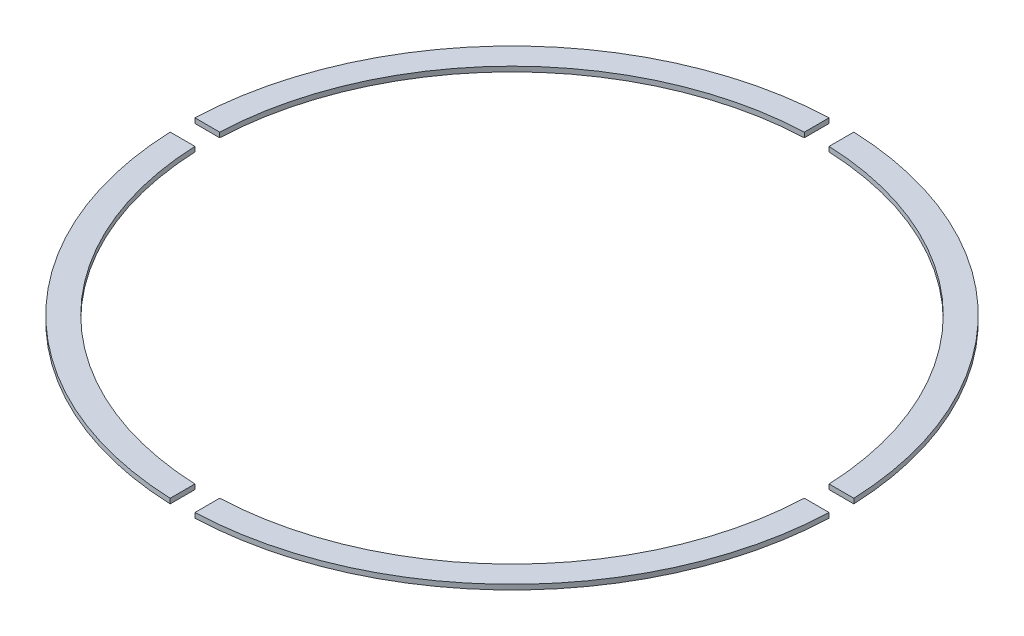
ISO-10303-21;
HEADER;
FILE_DESCRIPTION(('STEP AP214'),'2;1');
FILE_NAME('part.step','',(''),(''),'','','');
FILE_SCHEMA(('AUTOMOTIVE_DESIGN { 1 0 10303 214 1 1 1 1 }'));
ENDSEC;
DATA;
#1=APPLICATION_CONTEXT('core data for automotive mechanical design processes');
#2=APPLICATION_PROTOCOL_DEFINITION('international standard','automotive_design',2000,#1);
#3=PRODUCT_CONTEXT('',#1,'mechanical');
#4=PRODUCT('Part','Part','',(#3));
#5=PRODUCT_RELATED_PRODUCT_CATEGORY('part','',(#4));
#6=PRODUCT_DEFINITION_FORMATION('','',#4);
#7=PRODUCT_DEFINITION_CONTEXT('part definition',#1,'design');
#8=PRODUCT_DEFINITION('design','',#6,#7);
#9=PRODUCT_DEFINITION_SHAPE('','',#8);
#10=(LENGTH_UNIT() NAMED_UNIT(*) SI_UNIT(.MILLI.,.METRE.));
#11=(NAMED_UNIT(*) PLANE_ANGLE_UNIT() SI_UNIT($,.RADIAN.));
#12=(NAMED_UNIT(*) SI_UNIT($,.STERADIAN.) SOLID_ANGLE_UNIT());
#13=UNCERTAINTY_MEASURE_WITH_UNIT(LENGTH_MEASURE(1.E-05),#10,'distance_accuracy_value','');
#14=(GEOMETRIC_REPRESENTATION_CONTEXT(3) GLOBAL_UNCERTAINTY_ASSIGNED_CONTEXT((#13)) GLOBAL_UNIT_ASSIGNED_CONTEXT((#10,
#11,#12)) REPRESENTATION_CONTEXT('',''));
#15=CARTESIAN_POINT('',(0.,0.,0.));
#16=DIRECTION('',(0.,0.,1.));
#17=DIRECTION('',(1.,0.,0.));
#18=AXIS2_PLACEMENT_3D('',#15,#16,#17);
#19=CARTESIAN_POINT('',(0.,1.5,0.));
#20=DIRECTION('',(0.,1.,0.));
#21=DIRECTION('',(0.,0.,1.));
#22=AXIS2_PLACEMENT_3D('',#19,#20,#21);
#23=PLANE('',#22);
#24=DIRECTION('',(0.,0.,-1.));
#25=VECTOR('',#24,1.);
#26=CARTESIAN_POINT('',(7.49999999999945,1.5,157.644661834944));
#27=LINE('',#26,#25);
#28=CARTESIAN_POINT('',(7.4999999999993,1.5,199.859325526731));
#29=VERTEX_POINT('',#28);
#30=CARTESIAN_POINT('',(7.49999999999936,1.5,184.847910456137));
#31=VERTEX_POINT('',#30);
#32=EDGE_CURVE('E53',#29,#31,#27,.T.);
#33=ORIENTED_EDGE('',*,*,#32,.F.);
#34=CARTESIAN_POINT('',(0.,1.5,0.));
#35=DIRECTION('',(0.,1.,0.));
#36=DIRECTION('',(0.,0.,1.));
#37=AXIS2_PLACEMENT_3D('',#34,#35,#36);
#38=CIRCLE('',#37,200.);
#39=CARTESIAN_POINT('',(199.859325526731,1.5,7.5));
#40=VERTEX_POINT('',#39);
#41=EDGE_CURVE('E105',#29,#40,#38,.T.);
#42=ORIENTED_EDGE('',*,*,#41,.T.);
#43=DIRECTION('',(1.,0.,0.));
#44=VECTOR('',#43,1.);
#45=CARTESIAN_POINT('',(157.644661834944,1.5,7.5));
#46=LINE('',#45,#44);
#47=CARTESIAN_POINT('',(184.847910456137,1.5,7.5));
#48=VERTEX_POINT('',#47);
#49=EDGE_CURVE('E86',#48,#40,#46,.T.);
#50=ORIENTED_EDGE('',*,*,#49,.F.);
#51=CARTESIAN_POINT('',(0.,1.5,0.));
#52=DIRECTION('',(0.,1.,0.));
#53=DIRECTION('',(0.,0.,1.));
#54=AXIS2_PLACEMENT_3D('',#51,#52,#53);
#55=CIRCLE('',#54,185.);
#56=EDGE_CURVE('E92',#31,#48,#55,.T.);
#57=ORIENTED_EDGE('',*,*,#56,.F.);
#58=EDGE_LOOP('',(#33,#42,#50,#57));
#59=FACE_BOUND('',#58,.T.);
#60=ADVANCED_FACE('F45',(#59),#23,.T.);
#61=CARTESIAN_POINT('',(0.,-1.5,0.));
#62=DIRECTION('',(0.,1.,0.));
#63=DIRECTION('',(0.,0.,1.));
#64=AXIS2_PLACEMENT_3D('',#61,#62,#63);
#65=PLANE('',#64);
#66=CARTESIAN_POINT('',(0.,-1.5,0.));
#67=DIRECTION('',(0.,1.,0.));
#68=DIRECTION('',(0.,0.,1.));
#69=AXIS2_PLACEMENT_3D('',#66,#67,#68);
#70=CIRCLE('',#69,200.);
#71=CARTESIAN_POINT('',(7.4999999999993,-1.5,199.859325526731));
#72=VERTEX_POINT('',#71);
#73=CARTESIAN_POINT('',(199.859325526731,-1.5,7.5));
#74=VERTEX_POINT('',#73);
#75=EDGE_CURVE('E48',#72,#74,#70,.T.);
#76=ORIENTED_EDGE('',*,*,#75,.F.);
#77=DIRECTION('',(0.,0.,-1.));
#78=VECTOR('',#77,1.);
#79=CARTESIAN_POINT('',(7.49999999999945,-1.5,157.644661834944));
#80=LINE('',#79,#78);
#81=CARTESIAN_POINT('',(7.49999999999936,-1.5,184.847910456137));
#82=VERTEX_POINT('',#81);
#83=EDGE_CURVE('E65',#72,#82,#80,.T.);
#84=ORIENTED_EDGE('',*,*,#83,.T.);
#85=CARTESIAN_POINT('',(0.,-1.5,0.));
#86=DIRECTION('',(0.,1.,0.));
#87=DIRECTION('',(0.,0.,1.));
#88=AXIS2_PLACEMENT_3D('',#85,#86,#87);
#89=CIRCLE('',#88,185.);
#90=CARTESIAN_POINT('',(184.847910456137,-1.5,7.5));
#91=VERTEX_POINT('',#90);
#92=EDGE_CURVE('E94',#82,#91,#89,.T.);
#93=ORIENTED_EDGE('',*,*,#92,.T.);
#94=DIRECTION('',(1.,0.,0.));
#95=VECTOR('',#94,1.);
#96=CARTESIAN_POINT('',(157.644661834944,-1.5,7.5));
#97=LINE('',#96,#95);
#98=EDGE_CURVE('E104',#91,#74,#97,.T.);
#99=ORIENTED_EDGE('',*,*,#98,.T.);
#100=EDGE_LOOP('',(#76,#84,#93,#99));
#101=FACE_BOUND('',#100,.T.);
#102=ADVANCED_FACE('F114',(#101),#65,.F.);
#103=CARTESIAN_POINT('',(0.,1.5,0.));
#104=DIRECTION('',(0.,-1.,0.));
#105=DIRECTION('',(0.,0.,-1.));
#106=AXIS2_PLACEMENT_3D('',#103,#104,#105);
#107=CYLINDRICAL_SURFACE('',#106,200.);
#108=ORIENTED_EDGE('',*,*,#41,.F.);
#109=DIRECTION('',(0.,-1.,0.));
#110=VECTOR('',#109,1.);
#111=CARTESIAN_POINT('',(7.4999999999993,1.5,199.859325526731));
#112=LINE('',#111,#110);
#113=EDGE_CURVE('E61',#29,#72,#112,.T.);
#114=ORIENTED_EDGE('',*,*,#113,.T.);
#115=ORIENTED_EDGE('',*,*,#75,.T.);
#116=DIRECTION('',(0.,-1.,0.));
#117=VECTOR('',#116,1.);
#118=CARTESIAN_POINT('',(199.859325526731,1.5,7.5));
#119=LINE('',#118,#117);
#120=EDGE_CURVE('E98',#74,#40,#119,.F.);
#121=ORIENTED_EDGE('',*,*,#120,.T.);
#122=EDGE_LOOP('',(#108,#114,#115,#121));
#123=FACE_BOUND('',#122,.T.);
#124=ADVANCED_FACE('F119',(#123),#107,.T.);
#125=CARTESIAN_POINT('',(0.,1.5,0.));
#126=DIRECTION('',(0.,-1.,0.));
#127=DIRECTION('',(0.,0.,-1.));
#128=AXIS2_PLACEMENT_3D('',#125,#126,#127);
#129=CYLINDRICAL_SURFACE('',#128,185.);
#130=DIRECTION('',(0.,-1.,0.));
#131=VECTOR('',#130,1.);
#132=CARTESIAN_POINT('',(7.49999999999936,1.5,184.847910456137));
#133=LINE('',#132,#131);
#134=EDGE_CURVE('E12',#31,#82,#133,.T.);
#135=ORIENTED_EDGE('',*,*,#134,.F.);
#136=ORIENTED_EDGE('',*,*,#56,.T.);
#137=DIRECTION('',(0.,-1.,0.));
#138=VECTOR('',#137,1.);
#139=CARTESIAN_POINT('',(184.847910456137,1.5,7.5));
#140=LINE('',#139,#138);
#141=EDGE_CURVE('E97',#91,#48,#140,.F.);
#142=ORIENTED_EDGE('',*,*,#141,.F.);
#143=ORIENTED_EDGE('',*,*,#92,.F.);
#144=EDGE_LOOP('',(#135,#136,#142,#143));
#145=FACE_BOUND('',#144,.T.);
#146=ADVANCED_FACE('F90',(#145),#129,.F.);
#147=CARTESIAN_POINT('',(157.644661834944,-1.5,7.5));
#148=DIRECTION('',(0.,0.,1.));
#149=DIRECTION('',(1.,0.,0.));
#150=AXIS2_PLACEMENT_3D('',#147,#148,#149);
#151=PLANE('',#150);
#152=ORIENTED_EDGE('',*,*,#98,.F.);
#153=ORIENTED_EDGE('',*,*,#141,.T.);
#154=ORIENTED_EDGE('',*,*,#49,.T.);
#155=ORIENTED_EDGE('',*,*,#120,.F.);
#156=EDGE_LOOP('',(#152,#153,#154,#155));
#157=FACE_BOUND('',#156,.T.);
#158=ADVANCED_FACE('F117',(#157),#151,.F.);
#159=CARTESIAN_POINT('',(7.49999999999945,-1.5,157.644661834944));
#160=DIRECTION('',(1.,0.,0.));
#161=DIRECTION('',(0.,0.,-1.));
#162=AXIS2_PLACEMENT_3D('',#159,#160,#161);
#163=PLANE('',#162);
#164=ORIENTED_EDGE('',*,*,#32,.T.);
#165=ORIENTED_EDGE('',*,*,#134,.T.);
#166=ORIENTED_EDGE('',*,*,#83,.F.);
#167=ORIENTED_EDGE('',*,*,#113,.F.);
#168=EDGE_LOOP('',(#164,#165,#166,#167));
#169=FACE_BOUND('',#168,.T.);
#170=ADVANCED_FACE('F82',(#169),#163,.F.);
#171=CLOSED_SHELL('',(#60,#102,#124,#146,#158,#170));
#172=MANIFOLD_SOLID_BREP('B2',#171);
#173=CARTESIAN_POINT('',(0.,1.5,0.));
#174=DIRECTION('',(0.,-1.,0.));
#175=DIRECTION('',(0.,0.,-1.));
#176=AXIS2_PLACEMENT_3D('',#173,#174,#175);
#177=CYLINDRICAL_SURFACE('',#176,200.);
#178=CARTESIAN_POINT('',(0.,-1.5,0.));
#179=DIRECTION('',(0.,1.,0.));
#180=DIRECTION('',(0.,0.,1.));
#181=AXIS2_PLACEMENT_3D('',#178,#179,#180);
#182=CIRCLE('',#181,200.);
#183=CARTESIAN_POINT('',(-7.49999999999791,-1.5,-199.859325526732));
#184=VERTEX_POINT('',#183);
#185=CARTESIAN_POINT('',(-199.859325526731,-1.5,-7.5));
#186=VERTEX_POINT('',#185);
#187=EDGE_CURVE('E182',#184,#186,#182,.T.);
#188=ORIENTED_EDGE('',*,*,#187,.T.);
#189=DIRECTION('',(0.,-1.,0.));
#190=VECTOR('',#189,1.);
#191=CARTESIAN_POINT('',(-199.859325526731,1.5,-7.5));
#192=LINE('',#191,#190);
#193=CARTESIAN_POINT('',(-199.859325526731,1.5,-7.5));
#194=VERTEX_POINT('',#193);
#195=EDGE_CURVE('E196',#186,#194,#192,.F.);
#196=ORIENTED_EDGE('',*,*,#195,.T.);
#197=CARTESIAN_POINT('',(0.,1.5,0.));
#198=DIRECTION('',(0.,1.,0.));
#199=DIRECTION('',(0.,0.,1.));
#200=AXIS2_PLACEMENT_3D('',#197,#198,#199);
#201=CIRCLE('',#200,200.);
#202=CARTESIAN_POINT('',(-7.49999999999791,1.5,-199.859325526732));
#203=VERTEX_POINT('',#202);
#204=EDGE_CURVE('E241',#203,#194,#201,.T.);
#205=ORIENTED_EDGE('',*,*,#204,.F.);
#206=DIRECTION('',(0.,-1.,0.));
#207=VECTOR('',#206,1.);
#208=CARTESIAN_POINT('',(-7.49999999999791,1.5,-199.859325526732));
#209=LINE('',#208,#207);
#210=EDGE_CURVE('E217',#203,#184,#209,.T.);
#211=ORIENTED_EDGE('',*,*,#210,.T.);
#212=EDGE_LOOP('',(#188,#196,#205,#211));
#213=FACE_BOUND('',#212,.T.);
#214=ADVANCED_FACE('F178',(#213),#177,.T.);
#215=CARTESIAN_POINT('',(0.,1.5,0.));
#216=DIRECTION('',(0.,-1.,0.));
#217=DIRECTION('',(0.,0.,-1.));
#218=AXIS2_PLACEMENT_3D('',#215,#216,#217);
#219=CYLINDRICAL_SURFACE('',#218,185.);
#220=DIRECTION('',(0.,-1.,0.));
#221=VECTOR('',#220,1.);
#222=CARTESIAN_POINT('',(-184.847910456137,1.5,-7.5));
#223=LINE('',#222,#221);
#224=CARTESIAN_POINT('',(-184.847910456137,-1.5,-7.5));
#225=VERTEX_POINT('',#224);
#226=CARTESIAN_POINT('',(-184.847910456137,1.5,-7.5));
#227=VERTEX_POINT('',#226);
#228=EDGE_CURVE('E188',#225,#227,#223,.F.);
#229=ORIENTED_EDGE('',*,*,#228,.F.);
#230=CARTESIAN_POINT('',(0.,-1.5,0.));
#231=DIRECTION('',(0.,1.,0.));
#232=DIRECTION('',(0.,0.,1.));
#233=AXIS2_PLACEMENT_3D('',#230,#231,#232);
#234=CIRCLE('',#233,185.);
#235=CARTESIAN_POINT('',(-7.49999999999806,-1.5,-184.847910456137));
#236=VERTEX_POINT('',#235);
#237=EDGE_CURVE('E227',#236,#225,#234,.T.);
#238=ORIENTED_EDGE('',*,*,#237,.F.);
#239=DIRECTION('',(0.,-1.,0.));
#240=VECTOR('',#239,1.);
#241=CARTESIAN_POINT('',(-7.49999999999806,1.5,-184.847910456137));
#242=LINE('',#241,#240);
#243=CARTESIAN_POINT('',(-7.49999999999807,1.5,-184.847910456137));
#244=VERTEX_POINT('',#243);
#245=EDGE_CURVE('E236',#244,#236,#242,.T.);
#246=ORIENTED_EDGE('',*,*,#245,.F.);
#247=CARTESIAN_POINT('',(0.,1.5,0.));
#248=DIRECTION('',(0.,1.,0.));
#249=DIRECTION('',(0.,0.,1.));
#250=AXIS2_PLACEMENT_3D('',#247,#248,#249);
#251=CIRCLE('',#250,185.);
#252=EDGE_CURVE('E235',#244,#227,#251,.T.);
#253=ORIENTED_EDGE('',*,*,#252,.T.);
#254=EDGE_LOOP('',(#229,#238,#246,#253));
#255=FACE_BOUND('',#254,.T.);
#256=ADVANCED_FACE('F232',(#255),#219,.F.);
#257=CARTESIAN_POINT('',(0.,-1.5,0.));
#258=DIRECTION('',(0.,1.,0.));
#259=DIRECTION('',(0.,0.,1.));
#260=AXIS2_PLACEMENT_3D('',#257,#258,#259);
#261=PLANE('',#260);
#262=ORIENTED_EDGE('',*,*,#237,.T.);
#263=DIRECTION('',(-1.,0.,0.));
#264=VECTOR('',#263,1.);
#265=CARTESIAN_POINT('',(-157.644661834944,-1.5,-7.5));
#266=LINE('',#265,#264);
#267=EDGE_CURVE('E219',#225,#186,#266,.T.);
#268=ORIENTED_EDGE('',*,*,#267,.T.);
#269=ORIENTED_EDGE('',*,*,#187,.F.);
#270=DIRECTION('',(0.,0.,1.));
#271=VECTOR('',#270,1.);
#272=CARTESIAN_POINT('',(-7.49999999999835,-1.5,-157.644661834944));
#273=LINE('',#272,#271);
#274=EDGE_CURVE('E214',#184,#236,#273,.T.);
#275=ORIENTED_EDGE('',*,*,#274,.T.);
#276=EDGE_LOOP('',(#262,#268,#269,#275));
#277=FACE_BOUND('',#276,.T.);
#278=ADVANCED_FACE('F238',(#277),#261,.F.);
#279=CARTESIAN_POINT('',(0.,1.5,0.));
#280=DIRECTION('',(0.,1.,0.));
#281=DIRECTION('',(0.,0.,1.));
#282=AXIS2_PLACEMENT_3D('',#279,#280,#281);
#283=PLANE('',#282);
#284=DIRECTION('',(-1.,0.,0.));
#285=VECTOR('',#284,1.);
#286=CARTESIAN_POINT('',(-157.644661834944,1.5,-7.5));
#287=LINE('',#286,#285);
#288=EDGE_CURVE('E43',#227,#194,#287,.T.);
#289=ORIENTED_EDGE('',*,*,#288,.F.);
#290=ORIENTED_EDGE('',*,*,#252,.F.);
#291=DIRECTION('',(0.,0.,1.));
#292=VECTOR('',#291,1.);
#293=CARTESIAN_POINT('',(-7.49999999999835,1.5,-157.644661834944));
#294=LINE('',#293,#292);
#295=EDGE_CURVE('E243',#203,#244,#294,.T.);
#296=ORIENTED_EDGE('',*,*,#295,.F.);
#297=ORIENTED_EDGE('',*,*,#204,.T.);
#298=EDGE_LOOP('',(#289,#290,#296,#297));
#299=FACE_BOUND('',#298,.T.);
#300=ADVANCED_FACE('F180',(#299),#283,.T.);
#301=CARTESIAN_POINT('',(-7.49999999999835,-1.5,-157.644661834944));
#302=DIRECTION('',(-1.,0.,0.));
#303=DIRECTION('',(0.,0.,1.));
#304=AXIS2_PLACEMENT_3D('',#301,#302,#303);
#305=PLANE('',#304);
#306=ORIENTED_EDGE('',*,*,#295,.T.);
#307=ORIENTED_EDGE('',*,*,#245,.T.);
#308=ORIENTED_EDGE('',*,*,#274,.F.);
#309=ORIENTED_EDGE('',*,*,#210,.F.);
#310=EDGE_LOOP('',(#306,#307,#308,#309));
#311=FACE_BOUND('',#310,.T.);
#312=ADVANCED_FACE('F249',(#311),#305,.F.);
#313=CARTESIAN_POINT('',(-157.644661834944,-1.5,-7.5));
#314=DIRECTION('',(0.,0.,-1.));
#315=DIRECTION('',(-1.,0.,0.));
#316=AXIS2_PLACEMENT_3D('',#313,#314,#315);
#317=PLANE('',#316);
#318=ORIENTED_EDGE('',*,*,#267,.F.);
#319=ORIENTED_EDGE('',*,*,#228,.T.);
#320=ORIENTED_EDGE('',*,*,#288,.T.);
#321=ORIENTED_EDGE('',*,*,#195,.F.);
#322=EDGE_LOOP('',(#318,#319,#320,#321));
#323=FACE_BOUND('',#322,.T.);
#324=ADVANCED_FACE('F221',(#323),#317,.F.);
#325=CLOSED_SHELL('',(#214,#256,#278,#300,#312,#324));
#326=MANIFOLD_SOLID_BREP('B6',#325);
#327=CARTESIAN_POINT('',(157.644661834944,-1.5,-7.5));
#328=DIRECTION('',(0.,0.,-1.));
#329=DIRECTION('',(-1.,0.,0.));
#330=AXIS2_PLACEMENT_3D('',#327,#328,#329);
#331=PLANE('',#330);
#332=DIRECTION('',(-1.,0.,0.));
#333=VECTOR('',#332,1.);
#334=CARTESIAN_POINT('',(157.644661834944,1.5,-7.5));
#335=LINE('',#334,#333);
#336=CARTESIAN_POINT('',(199.859325526731,1.5,-7.5));
#337=VERTEX_POINT('',#336);
#338=CARTESIAN_POINT('',(184.847910456137,1.5,-7.5));
#339=VERTEX_POINT('',#338);
#340=EDGE_CURVE('E375',#337,#339,#335,.T.);
#341=ORIENTED_EDGE('',*,*,#340,.T.);
#342=DIRECTION('',(0.,-1.,0.));
#343=VECTOR('',#342,1.);
#344=CARTESIAN_POINT('',(184.847910456137,1.5,-7.5));
#345=LINE('',#344,#343);
#346=CARTESIAN_POINT('',(184.847910456137,-1.5,-7.5));
#347=VERTEX_POINT('',#346);
#348=EDGE_CURVE('E363',#339,#347,#345,.T.);
#349=ORIENTED_EDGE('',*,*,#348,.T.);
#350=DIRECTION('',(-1.,0.,0.));
#351=VECTOR('',#350,1.);
#352=CARTESIAN_POINT('',(157.644661834944,-1.5,-7.5));
#353=LINE('',#352,#351);
#354=CARTESIAN_POINT('',(199.859325526731,-1.5,-7.5));
#355=VERTEX_POINT('',#354);
#356=EDGE_CURVE('E371',#355,#347,#353,.T.);
#357=ORIENTED_EDGE('',*,*,#356,.F.);
#358=DIRECTION('',(0.,-1.,0.));
#359=VECTOR('',#358,1.);
#360=CARTESIAN_POINT('',(199.859325526731,1.5,-7.5));
#361=LINE('',#360,#359);
#362=EDGE_CURVE('E364',#337,#355,#361,.T.);
#363=ORIENTED_EDGE('',*,*,#362,.F.);
#364=EDGE_LOOP('',(#341,#349,#357,#363));
#365=FACE_BOUND('',#364,.T.);
#366=ADVANCED_FACE('F310',(#365),#331,.F.);
#367=CARTESIAN_POINT('',(0.,1.5,0.));
#368=DIRECTION('',(0.,-1.,0.));
#369=DIRECTION('',(0.,0.,-1.));
#370=AXIS2_PLACEMENT_3D('',#367,#368,#369);
#371=CYLINDRICAL_SURFACE('',#370,200.);
#372=CARTESIAN_POINT('',(0.,-1.5,0.));
#373=DIRECTION('',(0.,1.,0.));
#374=DIRECTION('',(0.,0.,1.));
#375=AXIS2_PLACEMENT_3D('',#372,#373,#374);
#376=CIRCLE('',#375,200.);
#377=CARTESIAN_POINT('',(7.50000000000209,-1.5,-199.859325526731));
#378=VERTEX_POINT('',#377);
#379=EDGE_CURVE('E368',#355,#378,#376,.T.);
#380=ORIENTED_EDGE('',*,*,#379,.T.);
#381=DIRECTION('',(0.,-1.,0.));
#382=VECTOR('',#381,1.);
#383=CARTESIAN_POINT('',(7.50000000000209,1.5,-199.859325526731));
#384=LINE('',#383,#382);
#385=CARTESIAN_POINT('',(7.50000000000209,1.5,-199.859325526731));
#386=VERTEX_POINT('',#385);
#387=EDGE_CURVE('E328',#378,#386,#384,.F.);
#388=ORIENTED_EDGE('',*,*,#387,.T.);
#389=CARTESIAN_POINT('',(0.,1.5,0.));
#390=DIRECTION('',(0.,1.,0.));
#391=DIRECTION('',(0.,0.,1.));
#392=AXIS2_PLACEMENT_3D('',#389,#390,#391);
#393=CIRCLE('',#392,200.);
#394=EDGE_CURVE('E353',#337,#386,#393,.T.);
#395=ORIENTED_EDGE('',*,*,#394,.F.);
#396=ORIENTED_EDGE('',*,*,#362,.T.);
#397=EDGE_LOOP('',(#380,#388,#395,#396));
#398=FACE_BOUND('',#397,.T.);
#399=ADVANCED_FACE('F384',(#398),#371,.T.);
#400=CARTESIAN_POINT('',(0.,1.5,0.));
#401=DIRECTION('',(0.,-1.,0.));
#402=DIRECTION('',(0.,0.,-1.));
#403=AXIS2_PLACEMENT_3D('',#400,#401,#402);
#404=CYLINDRICAL_SURFACE('',#403,185.);
#405=DIRECTION('',(0.,-1.,0.));
#406=VECTOR('',#405,1.);
#407=CARTESIAN_POINT('',(7.50000000000193,1.5,-184.847910456137));
#408=LINE('',#407,#406);
#409=CARTESIAN_POINT('',(7.50000000000193,-1.5,-184.847910456137));
#410=VERTEX_POINT('',#409);
#411=CARTESIAN_POINT('',(7.50000000000193,1.5,-184.847910456137));
#412=VERTEX_POINT('',#411);
#413=EDGE_CURVE('E320',#410,#412,#408,.F.);
#414=ORIENTED_EDGE('',*,*,#413,.F.);
#415=CARTESIAN_POINT('',(0.,-1.5,0.));
#416=DIRECTION('',(0.,1.,0.));
#417=DIRECTION('',(0.,0.,1.));
#418=AXIS2_PLACEMENT_3D('',#415,#416,#417);
#419=CIRCLE('',#418,185.);
#420=EDGE_CURVE('E314',#347,#410,#419,.T.);
#421=ORIENTED_EDGE('',*,*,#420,.F.);
#422=ORIENTED_EDGE('',*,*,#348,.F.);
#423=CARTESIAN_POINT('',(0.,1.5,0.));
#424=DIRECTION('',(0.,1.,0.));
#425=DIRECTION('',(0.,0.,1.));
#426=AXIS2_PLACEMENT_3D('',#423,#424,#425);
#427=CIRCLE('',#426,185.);
#428=EDGE_CURVE('E359',#339,#412,#427,.T.);
#429=ORIENTED_EDGE('',*,*,#428,.T.);
#430=EDGE_LOOP('',(#414,#421,#422,#429));
#431=FACE_BOUND('',#430,.T.);
#432=ADVANCED_FACE('F362',(#431),#404,.F.);
#433=CARTESIAN_POINT('',(0.,-1.5,0.));
#434=DIRECTION('',(0.,1.,0.));
#435=DIRECTION('',(0.,0.,1.));
#436=AXIS2_PLACEMENT_3D('',#433,#434,#435);
#437=PLANE('',#436);
#438=ORIENTED_EDGE('',*,*,#420,.T.);
#439=DIRECTION('',(0.,0.,-1.));
#440=VECTOR('',#439,1.);
#441=CARTESIAN_POINT('',(7.50000000000165,-1.5,-157.644661834944));
#442=LINE('',#441,#440);
#443=EDGE_CURVE('E345',#410,#378,#442,.T.);
#444=ORIENTED_EDGE('',*,*,#443,.T.);
#445=ORIENTED_EDGE('',*,*,#379,.F.);
#446=ORIENTED_EDGE('',*,*,#356,.T.);
#447=EDGE_LOOP('',(#438,#444,#445,#446));
#448=FACE_BOUND('',#447,.T.);
#449=ADVANCED_FACE('F382',(#448),#437,.F.);
#450=CARTESIAN_POINT('',(0.,1.5,0.));
#451=DIRECTION('',(0.,1.,0.));
#452=DIRECTION('',(0.,0.,1.));
#453=AXIS2_PLACEMENT_3D('',#450,#451,#452);
#454=PLANE('',#453);
#455=DIRECTION('',(0.,0.,-1.));
#456=VECTOR('',#455,1.);
#457=CARTESIAN_POINT('',(7.50000000000165,1.5,-157.644661834944));
#458=LINE('',#457,#456);
#459=EDGE_CURVE('E176',#412,#386,#458,.T.);
#460=ORIENTED_EDGE('',*,*,#459,.F.);
#461=ORIENTED_EDGE('',*,*,#428,.F.);
#462=ORIENTED_EDGE('',*,*,#340,.F.);
#463=ORIENTED_EDGE('',*,*,#394,.T.);
#464=EDGE_LOOP('',(#460,#461,#462,#463));
#465=FACE_BOUND('',#464,.T.);
#466=ADVANCED_FACE('F312',(#465),#454,.T.);
#467=CARTESIAN_POINT('',(7.50000000000165,-1.5,-157.644661834944));
#468=DIRECTION('',(1.,0.,0.));
#469=DIRECTION('',(0.,0.,-1.));
#470=AXIS2_PLACEMENT_3D('',#467,#468,#469);
#471=PLANE('',#470);
#472=ORIENTED_EDGE('',*,*,#443,.F.);
#473=ORIENTED_EDGE('',*,*,#413,.T.);
#474=ORIENTED_EDGE('',*,*,#459,.T.);
#475=ORIENTED_EDGE('',*,*,#387,.F.);
#476=EDGE_LOOP('',(#472,#473,#474,#475));
#477=FACE_BOUND('',#476,.T.);
#478=ADVANCED_FACE('F348',(#477),#471,.F.);
#479=CLOSED_SHELL('',(#366,#399,#432,#449,#466,#478));
#480=MANIFOLD_SOLID_BREP('B37',#479);
#481=CARTESIAN_POINT('',(0.,1.5,0.));
#482=DIRECTION('',(0.,-1.,0.));
#483=DIRECTION('',(0.,0.,-1.));
#484=AXIS2_PLACEMENT_3D('',#481,#482,#483);
#485=CYLINDRICAL_SURFACE('',#484,200.);
#486=CARTESIAN_POINT('',(0.,-1.5,0.));
#487=DIRECTION('',(0.,1.,0.));
#488=DIRECTION('',(0.,0.,1.));
#489=AXIS2_PLACEMENT_3D('',#486,#487,#488);
#490=CIRCLE('',#489,200.);
#491=CARTESIAN_POINT('',(-199.859325526731,-1.5,7.5));
#492=VERTEX_POINT('',#491);
#493=CARTESIAN_POINT('',(-7.5000000000007,-1.5,199.859325526731));
#494=VERTEX_POINT('',#493);
#495=EDGE_CURVE('E491',#492,#494,#490,.T.);
#496=ORIENTED_EDGE('',*,*,#495,.T.);
#497=DIRECTION('',(0.,-1.,0.));
#498=VECTOR('',#497,1.);
#499=CARTESIAN_POINT('',(-7.5000000000007,1.5,199.859325526731));
#500=LINE('',#499,#498);
#501=CARTESIAN_POINT('',(-7.5000000000007,1.5,199.859325526731));
#502=VERTEX_POINT('',#501);
#503=EDGE_CURVE('E479',#494,#502,#500,.F.);
#504=ORIENTED_EDGE('',*,*,#503,.T.);
#505=CARTESIAN_POINT('',(0.,1.5,0.));
#506=DIRECTION('',(0.,1.,0.));
#507=DIRECTION('',(0.,0.,1.));
#508=AXIS2_PLACEMENT_3D('',#505,#506,#507);
#509=CIRCLE('',#508,200.);
#510=CARTESIAN_POINT('',(-199.859325526731,1.5,7.5));
#511=VERTEX_POINT('',#510);
#512=EDGE_CURVE('E486',#511,#502,#509,.T.);
#513=ORIENTED_EDGE('',*,*,#512,.F.);
#514=DIRECTION('',(0.,-1.,0.));
#515=VECTOR('',#514,1.);
#516=CARTESIAN_POINT('',(-199.859325526731,1.5,7.5));
#517=LINE('',#516,#515);
#518=EDGE_CURVE('E471',#511,#492,#517,.T.);
#519=ORIENTED_EDGE('',*,*,#518,.T.);
#520=EDGE_LOOP('',(#496,#504,#513,#519));
#521=FACE_BOUND('',#520,.T.);
#522=ADVANCED_FACE('F434',(#521),#485,.T.);
#523=CARTESIAN_POINT('',(0.,1.5,0.));
#524=DIRECTION('',(0.,-1.,0.));
#525=DIRECTION('',(0.,0.,-1.));
#526=AXIS2_PLACEMENT_3D('',#523,#524,#525);
#527=CYLINDRICAL_SURFACE('',#526,185.);
#528=DIRECTION('',(0.,-1.,0.));
#529=VECTOR('',#528,1.);
#530=CARTESIAN_POINT('',(-7.50000000000064,1.5,184.847910456137));
#531=LINE('',#530,#529);
#532=CARTESIAN_POINT('',(-7.50000000000064,-1.5,184.847910456137));
#533=VERTEX_POINT('',#532);
#534=CARTESIAN_POINT('',(-7.50000000000064,1.5,184.847910456137));
#535=VERTEX_POINT('',#534);
#536=EDGE_CURVE('E308',#533,#535,#531,.F.);
#537=ORIENTED_EDGE('',*,*,#536,.F.);
#538=CARTESIAN_POINT('',(0.,-1.5,0.));
#539=DIRECTION('',(0.,1.,0.));
#540=DIRECTION('',(0.,0.,1.));
#541=AXIS2_PLACEMENT_3D('',#538,#539,#540);
#542=CIRCLE('',#541,185.);
#543=CARTESIAN_POINT('',(-184.847910456137,-1.5,7.5));
#544=VERTEX_POINT('',#543);
#545=EDGE_CURVE('E495',#544,#533,#542,.T.);
#546=ORIENTED_EDGE('',*,*,#545,.F.);
#547=DIRECTION('',(0.,-1.,0.));
#548=VECTOR('',#547,1.);
#549=CARTESIAN_POINT('',(-184.847910456137,1.5,7.5));
#550=LINE('',#549,#548);
#551=CARTESIAN_POINT('',(-184.847910456137,1.5,7.5));
#552=VERTEX_POINT('',#551);
#553=EDGE_CURVE('E441',#552,#544,#550,.T.);
#554=ORIENTED_EDGE('',*,*,#553,.F.);
#555=CARTESIAN_POINT('',(0.,1.5,0.));
#556=DIRECTION('',(0.,1.,0.));
#557=DIRECTION('',(0.,0.,1.));
#558=AXIS2_PLACEMENT_3D('',#555,#556,#557);
#559=CIRCLE('',#558,185.);
#560=EDGE_CURVE('E488',#552,#535,#559,.T.);
#561=ORIENTED_EDGE('',*,*,#560,.T.);
#562=EDGE_LOOP('',(#537,#546,#554,#561));
#563=FACE_BOUND('',#562,.T.);
#564=ADVANCED_FACE('F505',(#563),#527,.F.);
#565=CARTESIAN_POINT('',(0.,-1.5,0.));
#566=DIRECTION('',(0.,1.,0.));
#567=DIRECTION('',(0.,0.,1.));
#568=AXIS2_PLACEMENT_3D('',#565,#566,#567);
#569=PLANE('',#568);
#570=ORIENTED_EDGE('',*,*,#545,.T.);
#571=DIRECTION('',(0.,0.,1.));
#572=VECTOR('',#571,1.);
#573=CARTESIAN_POINT('',(-7.50000000000055,-1.5,157.644661834944));
#574=LINE('',#573,#572);
#575=EDGE_CURVE('E455',#533,#494,#574,.T.);
#576=ORIENTED_EDGE('',*,*,#575,.T.);
#577=ORIENTED_EDGE('',*,*,#495,.F.);
#578=DIRECTION('',(1.,0.,0.));
#579=VECTOR('',#578,1.);
#580=CARTESIAN_POINT('',(-157.644661834944,-1.5,7.5));
#581=LINE('',#580,#579);
#582=EDGE_CURVE('E474',#492,#544,#581,.T.);
#583=ORIENTED_EDGE('',*,*,#582,.T.);
#584=EDGE_LOOP('',(#570,#576,#577,#583));
#585=FACE_BOUND('',#584,.T.);
#586=ADVANCED_FACE('F508',(#585),#569,.F.);
#587=CARTESIAN_POINT('',(0.,1.5,0.));
#588=DIRECTION('',(0.,1.,0.));
#589=DIRECTION('',(0.,0.,1.));
#590=AXIS2_PLACEMENT_3D('',#587,#588,#589);
#591=PLANE('',#590);
#592=DIRECTION('',(0.,0.,1.));
#593=VECTOR('',#592,1.);
#594=CARTESIAN_POINT('',(-7.50000000000055,1.5,157.644661834944));
#595=LINE('',#594,#593);
#596=EDGE_CURVE('E500',#535,#502,#595,.T.);
#597=ORIENTED_EDGE('',*,*,#596,.F.);
#598=ORIENTED_EDGE('',*,*,#560,.F.);
#599=DIRECTION('',(1.,0.,0.));
#600=VECTOR('',#599,1.);
#601=CARTESIAN_POINT('',(-157.644661834944,1.5,7.5));
#602=LINE('',#601,#600);
#603=EDGE_CURVE('E448',#511,#552,#602,.T.);
#604=ORIENTED_EDGE('',*,*,#603,.F.);
#605=ORIENTED_EDGE('',*,*,#512,.T.);
#606=EDGE_LOOP('',(#597,#598,#604,#605));
#607=FACE_BOUND('',#606,.T.);
#608=ADVANCED_FACE('F485',(#607),#591,.T.);
#609=CARTESIAN_POINT('',(-157.644661834944,-1.5,7.5));
#610=DIRECTION('',(0.,0.,1.));
#611=DIRECTION('',(1.,0.,0.));
#612=AXIS2_PLACEMENT_3D('',#609,#610,#611);
#613=PLANE('',#612);
#614=ORIENTED_EDGE('',*,*,#603,.T.);
#615=ORIENTED_EDGE('',*,*,#553,.T.);
#616=ORIENTED_EDGE('',*,*,#582,.F.);
#617=ORIENTED_EDGE('',*,*,#518,.F.);
#618=EDGE_LOOP('',(#614,#615,#616,#617));
#619=FACE_BOUND('',#618,.T.);
#620=ADVANCED_FACE('F472',(#619),#613,.F.);
#621=CARTESIAN_POINT('',(-7.50000000000055,-1.5,157.644661834944));
#622=DIRECTION('',(-1.,0.,0.));
#623=DIRECTION('',(0.,0.,1.));
#624=AXIS2_PLACEMENT_3D('',#621,#622,#623);
#625=PLANE('',#624);
#626=ORIENTED_EDGE('',*,*,#575,.F.);
#627=ORIENTED_EDGE('',*,*,#536,.T.);
#628=ORIENTED_EDGE('',*,*,#596,.T.);
#629=ORIENTED_EDGE('',*,*,#503,.F.);
#630=EDGE_LOOP('',(#626,#627,#628,#629));
#631=FACE_BOUND('',#630,.T.);
#632=ADVANCED_FACE('F503',(#631),#625,.F.);
#633=CLOSED_SHELL('',(#522,#564,#586,#608,#620,#632));
#634=MANIFOLD_SOLID_BREP('B170',#633);
#635=ADVANCED_BREP_SHAPE_REPRESENTATION('',(#18,#172,#326,#480,#634),#14);
#636=SHAPE_DEFINITION_REPRESENTATION(#9,#635);
ENDSEC;
END-ISO-10303-21;
